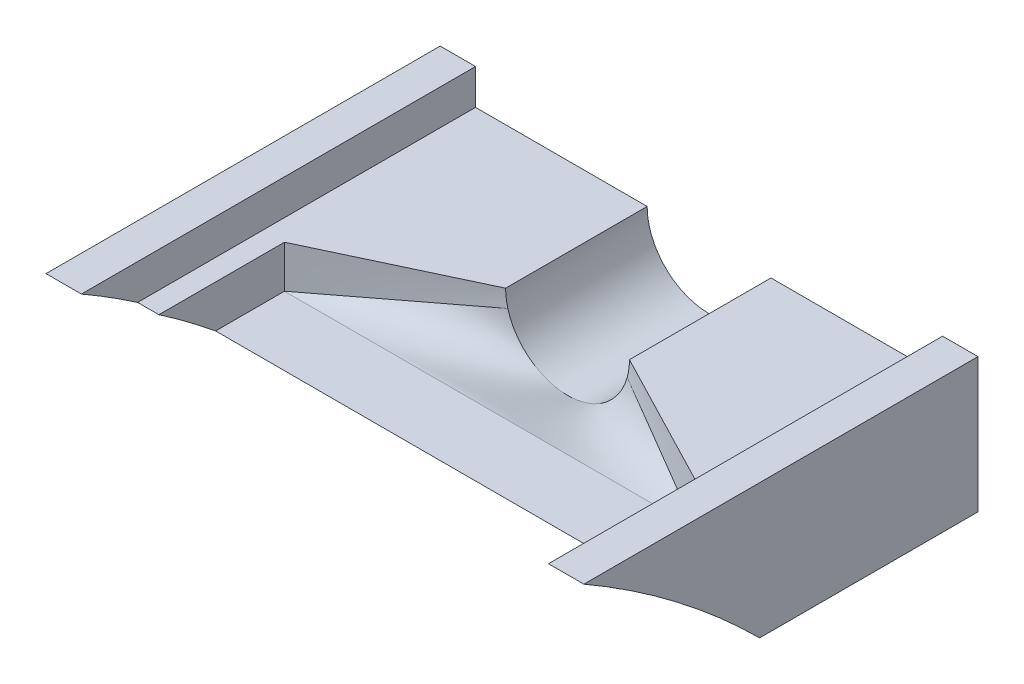
ISO-10303-21;
HEADER;
FILE_DESCRIPTION(('STEP AP214'),'2;1');
FILE_NAME('part.step','',(''),(''),'','','');
FILE_SCHEMA(('AUTOMOTIVE_DESIGN { 1 0 10303 214 1 1 1 1 }'));
ENDSEC;
DATA;
#1=APPLICATION_CONTEXT('core data for automotive mechanical design processes');
#2=APPLICATION_PROTOCOL_DEFINITION('international standard','automotive_design',2000,#1);
#3=PRODUCT_CONTEXT('',#1,'mechanical');
#4=PRODUCT('Part','Part','',(#3));
#5=PRODUCT_RELATED_PRODUCT_CATEGORY('part','',(#4));
#6=PRODUCT_DEFINITION_FORMATION('','',#4);
#7=PRODUCT_DEFINITION_CONTEXT('part definition',#1,'design');
#8=PRODUCT_DEFINITION('design','',#6,#7);
#9=PRODUCT_DEFINITION_SHAPE('','',#8);
#10=(LENGTH_UNIT() NAMED_UNIT(*) SI_UNIT(.MILLI.,.METRE.));
#11=(NAMED_UNIT(*) PLANE_ANGLE_UNIT() SI_UNIT($,.RADIAN.));
#12=(NAMED_UNIT(*) SI_UNIT($,.STERADIAN.) SOLID_ANGLE_UNIT());
#13=UNCERTAINTY_MEASURE_WITH_UNIT(LENGTH_MEASURE(1.E-05),#10,'distance_accuracy_value','');
#14=(GEOMETRIC_REPRESENTATION_CONTEXT(3) GLOBAL_UNCERTAINTY_ASSIGNED_CONTEXT((#13)) GLOBAL_UNIT_ASSIGNED_CONTEXT((#10,
#11,#12)) REPRESENTATION_CONTEXT('',''));
#15=CARTESIAN_POINT('',(0.,0.,0.));
#16=DIRECTION('',(0.,0.,1.));
#17=DIRECTION('',(1.,0.,0.));
#18=AXIS2_PLACEMENT_3D('',#15,#16,#17);
#19=CARTESIAN_POINT('',(-23.495,6.35,50.8));
#20=DIRECTION('',(0.,-1.,0.));
#21=DIRECTION('',(0.,0.,-1.));
#22=AXIS2_PLACEMENT_3D('',#19,#20,#21);
#23=PLANE('',#22);
#24=DIRECTION('',(0.,0.,-1.));
#25=VECTOR('',#24,1.);
#26=CARTESIAN_POINT('',(-20.32,6.35,50.800025));
#27=LINE('',#26,#25);
#28=CARTESIAN_POINT('',(-20.32,6.34999999999999,30.3182860225089));
#29=VERTEX_POINT('',#28);
#30=CARTESIAN_POINT('',(-20.32,6.35,0.));
#31=VERTEX_POINT('',#30);
#32=EDGE_CURVE('E371',#29,#31,#27,.T.);
#33=ORIENTED_EDGE('',*,*,#32,.F.);
#34=DIRECTION('',(1.,0.,0.));
#35=VECTOR('',#34,1.);
#36=CARTESIAN_POINT('',(-23.495,6.34999999999999,30.3182860225089));
#37=LINE('',#36,#35);
#38=CARTESIAN_POINT('',(-18.415,6.34999999999999,30.3182860225089));
#39=VERTEX_POINT('',#38);
#40=EDGE_CURVE('E560',#29,#39,#37,.T.);
#41=ORIENTED_EDGE('',*,*,#40,.T.);
#42=DIRECTION('',(0.,0.,1.));
#43=VECTOR('',#42,1.);
#44=CARTESIAN_POINT('',(-18.415,6.35,19.05));
#45=LINE('',#44,#43);
#46=CARTESIAN_POINT('',(-18.415,6.35,19.05));
#47=VERTEX_POINT('',#46);
#48=EDGE_CURVE('E271',#47,#39,#45,.T.);
#49=ORIENTED_EDGE('',*,*,#48,.F.);
#50=CARTESIAN_POINT('',(-4.92125,6.35,12.7));
#51=CARTESIAN_POINT('',(-9.41916666666667,6.35,14.8166666666667));
#52=CARTESIAN_POINT('',(-13.9170833333333,6.35,16.9333333333333));
#53=CARTESIAN_POINT('',(-18.415,6.35,19.05));
#54=B_SPLINE_CURVE_WITH_KNOTS('',3,(#50,#51,#52,#53),.UNSPECIFIED.,.F.,.F.,(4,4),(0.,1.),.UNSPECIFIED.);
#55=CARTESIAN_POINT('',(-4.92125,6.35,12.7));
#56=VERTEX_POINT('',#55);
#57=EDGE_CURVE('E495',#56,#47,#54,.T.);
#58=ORIENTED_EDGE('',*,*,#57,.F.);
#59=DIRECTION('',(0.,0.,-1.));
#60=VECTOR('',#59,1.);
#61=CARTESIAN_POINT('',(-4.92125,6.35,12.7));
#62=LINE('',#61,#60);
#63=CARTESIAN_POINT('',(-4.92125,6.35,0.));
#64=VERTEX_POINT('',#63);
#65=EDGE_CURVE('E220',#64,#56,#62,.F.);
#66=ORIENTED_EDGE('',*,*,#65,.F.);
#67=DIRECTION('',(-1.,0.,0.));
#68=VECTOR('',#67,1.);
#69=CARTESIAN_POINT('',(-23.495,6.35,0.));
#70=LINE('',#69,#68);
#71=EDGE_CURVE('E457',#64,#31,#70,.T.);
#72=ORIENTED_EDGE('',*,*,#71,.T.);
#73=EDGE_LOOP('',(#33,#41,#49,#58,#66,#72));
#74=FACE_BOUND('',#73,.T.);
#75=ADVANCED_FACE('F68',(#74),#23,.F.);
#76=DIRECTION('',(0.,0.,1.));
#77=VECTOR('',#76,1.);
#78=CARTESIAN_POINT('',(18.415,6.35,19.05));
#79=LINE('',#78,#77);
#80=CARTESIAN_POINT('',(18.415,6.35,19.05));
#81=VERTEX_POINT('',#80);
#82=CARTESIAN_POINT('',(18.415,6.35,30.3182860225089));
#83=VERTEX_POINT('',#82);
#84=EDGE_CURVE('E263',#81,#83,#79,.T.);
#85=ORIENTED_EDGE('',*,*,#84,.T.);
#86=DIRECTION('',(1.,0.,0.));
#87=VECTOR('',#86,1.);
#88=CARTESIAN_POINT('',(-23.495,6.34999999999999,30.3182860225089));
#89=LINE('',#88,#87);
#90=CARTESIAN_POINT('',(21.59,6.34999999999997,30.3182860225089));
#91=VERTEX_POINT('',#90);
#92=EDGE_CURVE('E550',#83,#91,#89,.T.);
#93=ORIENTED_EDGE('',*,*,#92,.T.);
#94=DIRECTION('',(0.,0.,-1.));
#95=VECTOR('',#94,1.);
#96=CARTESIAN_POINT('',(21.59,6.35,50.800025));
#97=LINE('',#96,#95);
#98=CARTESIAN_POINT('',(21.59,6.35,0.));
#99=VERTEX_POINT('',#98);
#100=EDGE_CURVE('E189',#91,#99,#97,.T.);
#101=ORIENTED_EDGE('',*,*,#100,.T.);
#102=CARTESIAN_POINT('',(6.19125,6.35,0.));
#103=VERTEX_POINT('',#102);
#104=EDGE_CURVE('E90',#99,#103,#70,.T.);
#105=ORIENTED_EDGE('',*,*,#104,.T.);
#106=DIRECTION('',(0.,0.,-1.));
#107=VECTOR('',#106,1.);
#108=CARTESIAN_POINT('',(6.19125,6.35,12.7));
#109=LINE('',#108,#107);
#110=CARTESIAN_POINT('',(6.19125,6.35,12.7));
#111=VERTEX_POINT('',#110);
#112=EDGE_CURVE('E534',#111,#103,#109,.T.);
#113=ORIENTED_EDGE('',*,*,#112,.F.);
#114=CARTESIAN_POINT('',(18.415,6.35,19.05));
#115=CARTESIAN_POINT('',(14.3404166666667,6.35,16.9333333333333));
#116=CARTESIAN_POINT('',(10.2658333333333,6.35,14.8166666666667));
#117=CARTESIAN_POINT('',(6.19125,6.35,12.7));
#118=B_SPLINE_CURVE_WITH_KNOTS('',3,(#114,#115,#116,#117),.UNSPECIFIED.,.F.,.F.,(4,4),(0.,1.),.UNSPECIFIED.);
#119=EDGE_CURVE('E367',#111,#81,#118,.F.);
#120=ORIENTED_EDGE('',*,*,#119,.T.);
#121=EDGE_LOOP('',(#85,#93,#101,#105,#113,#120));
#122=FACE_BOUND('',#121,.T.);
#123=ADVANCED_FACE('F240',(#122),#23,.F.);
#124=CARTESIAN_POINT('',(0.,0.,0.));
#125=DIRECTION('',(0.,0.,1.));
#126=DIRECTION('',(1.,0.,0.));
#127=AXIS2_PLACEMENT_3D('',#124,#125,#126);
#128=PLANE('',#127);
#129=CARTESIAN_POINT('',(0.635,6.34999999999999,0.));
#130=DIRECTION('',(0.,0.,1.));
#131=DIRECTION('',(1.,0.,0.));
#132=AXIS2_PLACEMENT_3D('',#129,#130,#131);
#133=CIRCLE('',#132,5.55625);
#134=EDGE_CURVE('E76',#103,#64,#133,.F.);
#135=ORIENTED_EDGE('',*,*,#134,.F.);
#136=ORIENTED_EDGE('',*,*,#104,.F.);
#137=DIRECTION('',(0.,1.,0.));
#138=VECTOR('',#137,1.);
#139=CARTESIAN_POINT('',(21.59,6.35,0.));
#140=LINE('',#139,#138);
#141=CARTESIAN_POINT('',(21.59,9.525,0.));
#142=VERTEX_POINT('',#141);
#143=EDGE_CURVE('E470',#99,#142,#140,.T.);
#144=ORIENTED_EDGE('',*,*,#143,.T.);
#145=DIRECTION('',(1.,0.,0.));
#146=VECTOR('',#145,1.);
#147=CARTESIAN_POINT('',(21.59,9.525,0.));
#148=LINE('',#147,#146);
#149=CARTESIAN_POINT('',(24.765,9.525,0.));
#150=VERTEX_POINT('',#149);
#151=EDGE_CURVE('E468',#142,#150,#148,.T.);
#152=ORIENTED_EDGE('',*,*,#151,.T.);
#153=DIRECTION('',(0.,1.,0.));
#154=VECTOR('',#153,1.);
#155=CARTESIAN_POINT('',(24.765,6.35,0.));
#156=LINE('',#155,#154);
#157=CARTESIAN_POINT('',(24.765,-2.54,0.));
#158=VERTEX_POINT('',#157);
#159=EDGE_CURVE('E455',#158,#150,#156,.T.);
#160=ORIENTED_EDGE('',*,*,#159,.F.);
#161=DIRECTION('',(1.,0.,0.));
#162=VECTOR('',#161,1.);
#163=CARTESIAN_POINT('',(-23.495,-2.54,0.));
#164=LINE('',#163,#162);
#165=CARTESIAN_POINT('',(-23.495,-2.54,0.));
#166=VERTEX_POINT('',#165);
#167=EDGE_CURVE('E201',#166,#158,#164,.T.);
#168=ORIENTED_EDGE('',*,*,#167,.F.);
#169=DIRECTION('',(0.,-1.,0.));
#170=VECTOR('',#169,1.);
#171=CARTESIAN_POINT('',(-23.495,6.35,0.));
#172=LINE('',#171,#170);
#173=CARTESIAN_POINT('',(-23.495,9.525,0.));
#174=VERTEX_POINT('',#173);
#175=EDGE_CURVE('E206',#174,#166,#172,.T.);
#176=ORIENTED_EDGE('',*,*,#175,.F.);
#177=DIRECTION('',(-1.,0.,0.));
#178=VECTOR('',#177,1.);
#179=CARTESIAN_POINT('',(0.,9.525,0.));
#180=LINE('',#179,#178);
#181=CARTESIAN_POINT('',(-20.32,9.525,0.));
#182=VERTEX_POINT('',#181);
#183=EDGE_CURVE('E483',#182,#174,#180,.T.);
#184=ORIENTED_EDGE('',*,*,#183,.F.);
#185=DIRECTION('',(0.,1.,0.));
#186=VECTOR('',#185,1.);
#187=CARTESIAN_POINT('',(-20.32,0.,0.));
#188=LINE('',#187,#186);
#189=EDGE_CURVE('E475',#31,#182,#188,.T.);
#190=ORIENTED_EDGE('',*,*,#189,.F.);
#191=ORIENTED_EDGE('',*,*,#71,.F.);
#192=EDGE_LOOP('',(#135,#136,#144,#152,#160,#168,#176,#184,#190,#191));
#193=FACE_BOUND('',#192,.T.);
#194=ADVANCED_FACE('F237',(#193),#128,.F.);
#195=CARTESIAN_POINT('',(24.765,6.35,50.8));
#196=DIRECTION('',(-1.,0.,0.));
#197=DIRECTION('',(0.,0.,1.));
#198=AXIS2_PLACEMENT_3D('',#195,#196,#197);
#199=PLANE('',#198);
#200=DIRECTION('',(0.,0.,-1.));
#201=VECTOR('',#200,1.);
#202=CARTESIAN_POINT('',(24.765,9.525,50.800025));
#203=LINE('',#202,#201);
#204=CARTESIAN_POINT('',(24.765,9.525,35.3661608291781));
#205=VERTEX_POINT('',#204);
#206=EDGE_CURVE('E197',#205,#150,#203,.T.);
#207=ORIENTED_EDGE('',*,*,#206,.F.);
#208=CARTESIAN_POINT('',(24.765,-56.5150000000001,73.3813998788012));
#209=DIRECTION('',(1.,0.,0.));
#210=DIRECTION('',(0.,0.,-1.));
#211=AXIS2_PLACEMENT_3D('',#208,#209,#210);
#212=CIRCLE('',#211,76.2);
#213=CARTESIAN_POINT('',(24.765,-2.54,19.593488829942));
#214=VERTEX_POINT('',#213);
#215=EDGE_CURVE('E82',#214,#205,#212,.T.);
#216=ORIENTED_EDGE('',*,*,#215,.F.);
#217=DIRECTION('',(0.,0.,-1.));
#218=VECTOR('',#217,1.);
#219=CARTESIAN_POINT('',(24.765,-2.54,50.8));
#220=LINE('',#219,#218);
#221=EDGE_CURVE('E195',#214,#158,#220,.T.);
#222=ORIENTED_EDGE('',*,*,#221,.T.);
#223=ORIENTED_EDGE('',*,*,#159,.T.);
#224=EDGE_LOOP('',(#207,#216,#222,#223));
#225=FACE_BOUND('',#224,.T.);
#226=ADVANCED_FACE('F70',(#225),#199,.F.);
#227=CARTESIAN_POINT('',(-23.495,6.35,50.8));
#228=DIRECTION('',(1.,0.,0.));
#229=DIRECTION('',(0.,0.,-1.));
#230=AXIS2_PLACEMENT_3D('',#227,#228,#229);
#231=PLANE('',#230);
#232=DIRECTION('',(0.,0.,-1.));
#233=VECTOR('',#232,1.);
#234=CARTESIAN_POINT('',(-23.495,-2.54,50.8));
#235=LINE('',#234,#233);
#236=CARTESIAN_POINT('',(-23.495,-2.54,19.593488829942));
#237=VERTEX_POINT('',#236);
#238=EDGE_CURVE('E203',#237,#166,#235,.T.);
#239=ORIENTED_EDGE('',*,*,#238,.F.);
#240=CARTESIAN_POINT('',(-23.495,-56.5150000000001,73.3813998788012));
#241=DIRECTION('',(1.,0.,0.));
#242=DIRECTION('',(0.,0.,-1.));
#243=AXIS2_PLACEMENT_3D('',#240,#241,#242);
#244=CIRCLE('',#243,76.2);
#245=CARTESIAN_POINT('',(-23.495,9.52499999999999,35.3661608291781));
#246=VERTEX_POINT('',#245);
#247=EDGE_CURVE('E185',#237,#246,#244,.T.);
#248=ORIENTED_EDGE('',*,*,#247,.T.);
#249=DIRECTION('',(0.,0.,-1.));
#250=VECTOR('',#249,1.);
#251=CARTESIAN_POINT('',(-23.495,9.525,50.800025));
#252=LINE('',#251,#250);
#253=EDGE_CURVE('E461',#246,#174,#252,.T.);
#254=ORIENTED_EDGE('',*,*,#253,.T.);
#255=ORIENTED_EDGE('',*,*,#175,.T.);
#256=EDGE_LOOP('',(#239,#248,#254,#255));
#257=FACE_BOUND('',#256,.T.);
#258=ADVANCED_FACE('F244',(#257),#231,.F.);
#259=CARTESIAN_POINT('',(-23.495,-2.54,50.8));
#260=DIRECTION('',(0.,1.,0.));
#261=DIRECTION('',(0.,0.,1.));
#262=AXIS2_PLACEMENT_3D('',#259,#260,#261);
#263=PLANE('',#262);
#264=ORIENTED_EDGE('',*,*,#221,.F.);
#265=DIRECTION('',(1.,0.,0.));
#266=VECTOR('',#265,1.);
#267=CARTESIAN_POINT('',(-23.495,-2.54,19.593488829942));
#268=LINE('',#267,#266);
#269=EDGE_CURVE('E182',#214,#237,#268,.F.);
#270=ORIENTED_EDGE('',*,*,#269,.T.);
#271=ORIENTED_EDGE('',*,*,#238,.T.);
#272=ORIENTED_EDGE('',*,*,#167,.T.);
#273=EDGE_LOOP('',(#264,#270,#271,#272));
#274=FACE_BOUND('',#273,.T.);
#275=ADVANCED_FACE('F199',(#274),#263,.F.);
#276=CARTESIAN_POINT('',(0.635,6.34999999999999,12.7));
#277=DIRECTION('',(0.,0.,-1.));
#278=DIRECTION('',(-1.,0.,0.));
#279=AXIS2_PLACEMENT_3D('',#276,#277,#278);
#280=CYLINDRICAL_SURFACE('',#279,5.55625);
#281=ORIENTED_EDGE('',*,*,#65,.T.);
#282=CARTESIAN_POINT('',(-4.72101864474134,4.87183277682016,12.7));
#283=CARTESIAN_POINT('',(-4.75418863957491,4.9920215538331,12.7));
#284=CARTESIAN_POINT('',(-4.81243507946018,5.23463461798272,12.7));
#285=CARTESIAN_POINT('',(-4.87512462747497,5.60360035578366,12.7));
#286=CARTESIAN_POINT('',(-4.91285362028412,5.97595354903661,12.7));
#287=CARTESIAN_POINT('',(-4.92125,6.22531804189409,12.7));
#288=CARTESIAN_POINT('',(-4.92125,6.35,12.7));
#289=B_SPLINE_CURVE_WITH_KNOTS('',3,(#282,#283,#284,#285,#286,#287,#288),.UNSPECIFIED.,.F.,.F.,
(4,1,1,1,4),(0.,0.0214285714285714,0.0428571428571429,0.0642857142857143,0.0857142857142857),.UNSPECIFIED.);
#290=CARTESIAN_POINT('',(-4.72139345933775,4.87172840631148,12.7));
#291=VERTEX_POINT('',#290);
#292=EDGE_CURVE('E215',#56,#291,#289,.F.);
#293=ORIENTED_EDGE('',*,*,#292,.T.);
#294=CARTESIAN_POINT('',(0.635,6.34999999999999,12.7));
#295=DIRECTION('',(0.,0.,1.));
#296=DIRECTION('',(1.,0.,0.));
#297=AXIS2_PLACEMENT_3D('',#294,#295,#296);
#298=CIRCLE('',#297,5.55625);
#299=CARTESIAN_POINT('',(5.99135033199777,4.87174042441235,12.7));
#300=VERTEX_POINT('',#299);
#301=EDGE_CURVE('E366',#291,#300,#298,.T.);
#302=ORIENTED_EDGE('',*,*,#301,.T.);
#303=EDGE_CURVE('E358',#300,#111,#298,.T.);
#304=ORIENTED_EDGE('',*,*,#303,.T.);
#305=ORIENTED_EDGE('',*,*,#112,.T.);
#306=ORIENTED_EDGE('',*,*,#134,.T.);
#307=EDGE_LOOP('',(#281,#293,#302,#304,#305,#306));
#308=FACE_BOUND('',#307,.T.);
#309=ADVANCED_FACE('F224',(#308),#280,.F.);
#310=CARTESIAN_POINT('',(-18.415,6.35,19.05));
#311=DIRECTION('',(-1.,0.,0.));
#312=DIRECTION('',(0.,-1.,0.));
#313=AXIS2_PLACEMENT_3D('',#310,#311,#312);
#314=PLANE('',#313);
#315=ORIENTED_EDGE('',*,*,#48,.T.);
#316=CARTESIAN_POINT('',(-18.4149999999999,-56.5150000000001,73.3813998788012));
#317=DIRECTION('',(-1.,0.,0.));
#318=DIRECTION('',(0.,-1.,0.));
#319=AXIS2_PLACEMENT_3D('',#316,#317,#318);
#320=CIRCLE('',#319,76.2);
#321=CARTESIAN_POINT('',(-18.415,2.54,25.2259539250984));
#322=VERTEX_POINT('',#321);
#323=EDGE_CURVE('E552',#39,#322,#320,.T.);
#324=ORIENTED_EDGE('',*,*,#323,.T.);
#325=DIRECTION('',(0.,0.,1.));
#326=VECTOR('',#325,1.);
#327=CARTESIAN_POINT('',(-18.415,2.54,19.05));
#328=LINE('',#327,#326);
#329=CARTESIAN_POINT('',(-18.415,2.54,19.05));
#330=VERTEX_POINT('',#329);
#331=EDGE_CURVE('E286',#330,#322,#328,.T.);
#332=ORIENTED_EDGE('',*,*,#331,.F.);
#333=CARTESIAN_POINT('',(-18.415,6.35,19.05));
#334=CARTESIAN_POINT('',(-18.415,6.0325,19.05));
#335=CARTESIAN_POINT('',(-18.415,5.3975,19.05));
#336=CARTESIAN_POINT('',(-18.415,4.445,19.05));
#337=CARTESIAN_POINT('',(-18.415,3.4925,19.05));
#338=CARTESIAN_POINT('',(-18.415,2.8575,19.05));
#339=CARTESIAN_POINT('',(-18.415,2.54,19.05));
#340=B_SPLINE_CURVE_WITH_KNOTS('',3,(#333,#334,#335,#336,#337,#338,#339),.UNSPECIFIED.,.F.,.F.,
(4,1,1,1,4),(0.,0.0214285714285714,0.0428571428571429,0.0642857142857143,0.0857142857142857),.UNSPECIFIED.);
#341=EDGE_CURVE('E281',#47,#330,#340,.T.);
#342=ORIENTED_EDGE('',*,*,#341,.F.);
#343=EDGE_LOOP('',(#315,#324,#332,#342));
#344=FACE_BOUND('',#343,.T.);
#345=ADVANCED_FACE('F234',(#344),#314,.F.);
#346=CARTESIAN_POINT('',(18.415,2.54,19.05));
#347=DIRECTION('',(1.,0.,0.));
#348=DIRECTION('',(0.,1.,0.));
#349=AXIS2_PLACEMENT_3D('',#346,#347,#348);
#350=PLANE('',#349);
#351=DIRECTION('',(0.,0.,1.));
#352=VECTOR('',#351,1.);
#353=CARTESIAN_POINT('',(18.415,2.54,19.05));
#354=LINE('',#353,#352);
#355=CARTESIAN_POINT('',(18.415,2.54,19.05));
#356=VERTEX_POINT('',#355);
#357=CARTESIAN_POINT('',(18.415,2.54,25.2259539250984));
#358=VERTEX_POINT('',#357);
#359=EDGE_CURVE('E272',#356,#358,#354,.T.);
#360=ORIENTED_EDGE('',*,*,#359,.T.);
#361=CARTESIAN_POINT('',(18.4149999999999,-56.5150000000001,73.3813998788012));
#362=DIRECTION('',(1.,0.,0.));
#363=DIRECTION('',(0.,1.,0.));
#364=AXIS2_PLACEMENT_3D('',#361,#362,#363);
#365=CIRCLE('',#364,76.2);
#366=EDGE_CURVE('E547',#358,#83,#365,.T.);
#367=ORIENTED_EDGE('',*,*,#366,.T.);
#368=ORIENTED_EDGE('',*,*,#84,.F.);
#369=CARTESIAN_POINT('',(18.415,2.54,19.05));
#370=CARTESIAN_POINT('',(18.415,2.8575,19.05));
#371=CARTESIAN_POINT('',(18.415,3.49249999999999,19.05));
#372=CARTESIAN_POINT('',(18.415,4.44500000000001,19.05));
#373=CARTESIAN_POINT('',(18.415,5.39749999999999,19.05));
#374=CARTESIAN_POINT('',(18.415,6.0325,19.05));
#375=CARTESIAN_POINT('',(18.415,6.35,19.05));
#376=B_SPLINE_CURVE_WITH_KNOTS('',3,(#369,#370,#371,#372,#373,#374,#375),.UNSPECIFIED.,.F.,.F.,
(4,1,1,1,4),(0.914285714285714,0.935714285714286,0.957142857142857,0.978571428571429,1.),.UNSPECIFIED.);
#377=EDGE_CURVE('E294',#356,#81,#376,.T.);
#378=ORIENTED_EDGE('',*,*,#377,.F.);
#379=EDGE_LOOP('',(#360,#367,#368,#378));
#380=FACE_BOUND('',#379,.T.);
#381=ADVANCED_FACE('F316',(#380),#350,.F.);
#382=CARTESIAN_POINT('',(-18.415,2.54,19.05));
#383=DIRECTION('',(0.,-1.,0.));
#384=DIRECTION('',(0.,0.,-1.));
#385=AXIS2_PLACEMENT_3D('',#382,#383,#384);
#386=PLANE('',#385);
#387=ORIENTED_EDGE('',*,*,#331,.T.);
#388=DIRECTION('',(1.,0.,0.));
#389=VECTOR('',#388,1.);
#390=CARTESIAN_POINT('',(-23.495,2.54,25.2259539250984));
#391=LINE('',#390,#389);
#392=EDGE_CURVE('E549',#322,#358,#391,.T.);
#393=ORIENTED_EDGE('',*,*,#392,.T.);
#394=ORIENTED_EDGE('',*,*,#359,.F.);
#395=CARTESIAN_POINT('',(-18.415,2.54,19.05));
#396=CARTESIAN_POINT('',(-16.8804166666667,2.54,19.05));
#397=CARTESIAN_POINT('',(-13.81125,2.54,19.05));
#398=CARTESIAN_POINT('',(-9.2075,2.54,19.05));
#399=CARTESIAN_POINT('',(-4.60375,2.54,19.05));
#400=CARTESIAN_POINT('',(0.,2.54,19.05));
#401=CARTESIAN_POINT('',(4.60375,2.54,19.05));
#402=CARTESIAN_POINT('',(9.2075,2.54,19.05));
#403=CARTESIAN_POINT('',(13.81125,2.54,19.05));
#404=CARTESIAN_POINT('',(16.8804166666667,2.54,19.05));
#405=CARTESIAN_POINT('',(18.415,2.54,19.05));
#406=B_SPLINE_CURVE_WITH_KNOTS('',3,(#395,#396,#397,#398,#399,#400,#401,#402,#403,#404,#405),
.UNSPECIFIED.,.F.,.F.,(4,1,1,1,1,1,1,1,4),(0.0857142857142857,0.189285714285714,
0.292857142857143,0.396428571428571,0.5,0.603571428571429,0.707142857142857,0.810714285714286,
0.914285714285714),.UNSPECIFIED.);
#407=CARTESIAN_POINT('',(11.5341450872156,2.54,19.05));
#408=VERTEX_POINT('',#407);
#409=EDGE_CURVE('E338',#408,#356,#406,.T.);
#410=ORIENTED_EDGE('',*,*,#409,.F.);
#411=CARTESIAN_POINT('',(-18.415,2.54,19.05));
#412=CARTESIAN_POINT('',(-16.8804166666667,2.54,19.05));
#413=CARTESIAN_POINT('',(-13.81125,2.54,19.05));
#414=CARTESIAN_POINT('',(-9.2075,2.54,19.05));
#415=CARTESIAN_POINT('',(-4.60375,2.54,19.05));
#416=CARTESIAN_POINT('',(0.,2.54,19.05));
#417=CARTESIAN_POINT('',(4.60375,2.54,19.05));
#418=CARTESIAN_POINT('',(9.2075,2.54,19.05));
#419=CARTESIAN_POINT('',(13.81125,2.54,19.05));
#420=CARTESIAN_POINT('',(16.8804166666667,2.54,19.05));
#421=CARTESIAN_POINT('',(18.415,2.54,19.05));
#422=B_SPLINE_CURVE_WITH_KNOTS('',3,(#411,#412,#413,#414,#415,#416,#417,#418,#419,#420,#421),
.UNSPECIFIED.,.F.,.F.,(4,1,1,1,1,1,1,1,4),(0.0857142857142857,0.189285714285714,
0.292857142857143,0.396428571428571,0.5,0.603571428571429,0.707142857142857,0.810714285714286,
0.914285714285714),.UNSPECIFIED.);
#423=CARTESIAN_POINT('',(4.67923219690711,2.54,19.05));
#424=VERTEX_POINT('',#423);
#425=EDGE_CURVE('E705',#424,#408,#422,.T.);
#426=ORIENTED_EDGE('',*,*,#425,.F.);
#427=CARTESIAN_POINT('',(-18.415,2.54,19.05));
#428=CARTESIAN_POINT('',(-16.8804166666667,2.54,19.05));
#429=CARTESIAN_POINT('',(-13.81125,2.54,19.05));
#430=CARTESIAN_POINT('',(-9.2075,2.54,19.05));
#431=CARTESIAN_POINT('',(-4.60375,2.54,19.05));
#432=CARTESIAN_POINT('',(0.,2.54,19.05));
#433=CARTESIAN_POINT('',(4.60375,2.54,19.05));
#434=CARTESIAN_POINT('',(9.2075,2.54,19.05));
#435=CARTESIAN_POINT('',(13.81125,2.54,19.05));
#436=CARTESIAN_POINT('',(16.8804166666667,2.54,19.05));
#437=CARTESIAN_POINT('',(18.415,2.54,19.05));
#438=B_SPLINE_CURVE_WITH_KNOTS('',3,(#427,#428,#429,#430,#431,#432,#433,#434,#435,#436,#437),
.UNSPECIFIED.,.F.,.F.,(4,1,1,1,1,1,1,1,4),(0.0857142857142857,0.189285714285714,
0.292857142857143,0.396428571428571,0.5,0.603571428571429,0.707142857142857,0.810714285714286,
0.914285714285714),.UNSPECIFIED.);
#439=CARTESIAN_POINT('',(-11.5341450872156,2.54,19.05));
#440=VERTEX_POINT('',#439);
#441=EDGE_CURVE('E438',#440,#424,#438,.T.);
#442=ORIENTED_EDGE('',*,*,#441,.F.);
#443=CARTESIAN_POINT('',(-18.415,2.54,19.05));
#444=CARTESIAN_POINT('',(-16.8804166666667,2.54,19.05));
#445=CARTESIAN_POINT('',(-13.81125,2.54,19.05));
#446=CARTESIAN_POINT('',(-9.2075,2.54,19.05));
#447=CARTESIAN_POINT('',(-4.60375,2.54,19.05));
#448=CARTESIAN_POINT('',(0.,2.54,19.05));
#449=CARTESIAN_POINT('',(4.60375,2.54,19.05));
#450=CARTESIAN_POINT('',(9.2075,2.54,19.05));
#451=CARTESIAN_POINT('',(13.81125,2.54,19.05));
#452=CARTESIAN_POINT('',(16.8804166666667,2.54,19.05));
#453=CARTESIAN_POINT('',(18.415,2.54,19.05));
#454=B_SPLINE_CURVE_WITH_KNOTS('',3,(#443,#444,#445,#446,#447,#448,#449,#450,#451,#452,#453),
.UNSPECIFIED.,.F.,.F.,(4,1,1,1,1,1,1,1,4),(0.0857142857142857,0.189285714285714,
0.292857142857143,0.396428571428571,0.5,0.603571428571429,0.707142857142857,0.810714285714286,
0.914285714285714),.UNSPECIFIED.);
#455=EDGE_CURVE('E301',#330,#440,#454,.T.);
#456=ORIENTED_EDGE('',*,*,#455,.F.);
#457=EDGE_LOOP('',(#387,#393,#394,#410,#426,#442,#456));
#458=FACE_BOUND('',#457,.T.);
#459=ADVANCED_FACE('F306',(#458),#386,.F.);
#460=CARTESIAN_POINT('',(5.99101864474134,4.87183277682016,12.7));
#461=CARTESIAN_POINT('',(10.1323457631609,4.09455518454677,14.8166666666667));
#462=CARTESIAN_POINT('',(14.2736728815804,3.31727759227339,16.9333333333333));
#463=CARTESIAN_POINT('',(18.415,2.54,19.05));
#464=CARTESIAN_POINT('',(6.02418863957491,4.9920215538331,12.7));
#465=CARTESIAN_POINT('',(10.1544590930499,4.28051436922206,14.8166666666667));
#466=CARTESIAN_POINT('',(14.284729546525,3.56900718461103,16.9333333333333));
#467=CARTESIAN_POINT('',(18.415,2.8575,19.05));
#468=CARTESIAN_POINT('',(6.08243498444065,5.23463341009776,12.7));
#469=CARTESIAN_POINT('',(10.1932899896271,4.6539222733985,14.8166666666667));
#470=CARTESIAN_POINT('',(14.3041449948135,4.07321113669925,16.9333333333333));
#471=CARTESIAN_POINT('',(18.415,3.49249999999999,19.05));
#472=CARTESIAN_POINT('',(6.14512530557085,5.60360536168845,12.7));
#473=CARTESIAN_POINT('',(10.2350835370472,5.21740357445897,14.8166666666667));
#474=CARTESIAN_POINT('',(14.3250417685236,4.83120178722949,16.9333333333333));
#475=CARTESIAN_POINT('',(18.415,4.44500000000001,19.05));
#476=CARTESIAN_POINT('',(6.18285339053752,5.97595235940166,12.7));
#477=CARTESIAN_POINT('',(10.2602355936917,5.78313490626777,14.8166666666667));
#478=CARTESIAN_POINT('',(14.3376177968458,5.59031745313388,16.9333333333333));
#479=CARTESIAN_POINT('',(18.415,5.39749999999999,19.05));
#480=CARTESIAN_POINT('',(6.19125,6.22531804189409,12.7));
#481=CARTESIAN_POINT('',(10.2658333333333,6.16104536126272,14.8166666666667));
#482=CARTESIAN_POINT('',(14.3404166666667,6.09677268063136,16.9333333333333));
#483=CARTESIAN_POINT('',(18.415,6.0325,19.05));
#484=CARTESIAN_POINT('',(6.19125,6.35,12.7));
#485=CARTESIAN_POINT('',(10.2658333333333,6.35,14.8166666666667));
#486=CARTESIAN_POINT('',(14.3404166666667,6.35,16.9333333333333));
#487=CARTESIAN_POINT('',(18.415,6.35,19.05));
#488=B_SPLINE_SURFACE_WITH_KNOTS('',3,3,((#460,#461,#462,#463),(#464,#465,#466,#467),(#468,#469,
#470,#471),(#472,#473,#474,#475),(#476,#477,#478,#479),(#480,#481,#482,#483),(#484,#485,#486,
#487)),.UNSPECIFIED.,.F.,.F.,.F.,(4,1,1,1,4),(4,4),(0.914285714285714,0.935714285714286,
0.957142857142857,0.978571428571429,1.),(0.,1.),.UNSPECIFIED.);
#489=DIRECTION('',(0.878255120792634,-0.164837986995818,0.448883482481459));
#490=VECTOR('',#489,1.);
#491=CARTESIAN_POINT('',(12.2030093223707,3.70591638841008,15.875));
#492=LINE('',#491,#490);
#493=EDGE_CURVE('E445',#300,#356,#492,.T.);
#494=ORIENTED_EDGE('',*,*,#303,.F.);
#495=ORIENTED_EDGE('',*,*,#493,.T.);
#496=ORIENTED_EDGE('',*,*,#377,.T.);
#497=ORIENTED_EDGE('',*,*,#119,.F.);
#498=EDGE_LOOP('',(#494,#495,#496,#497));
#499=FACE_BOUND('',#498,.T.);
#500=ADVANCED_FACE('F315',(#499),#488,.F.);
#501=CARTESIAN_POINT('',(-4.72101864474134,4.87183277682016,12.7));
#502=CARTESIAN_POINT('',(-9.28567909649422,4.09455518454677,14.8166666666667));
#503=CARTESIAN_POINT('',(-13.8503395482471,3.31727759227339,16.9333333333333));
#504=CARTESIAN_POINT('',(-18.415,2.54,19.05));
#505=CARTESIAN_POINT('',(-4.56069700382723,4.29092035742267,12.7));
#506=CARTESIAN_POINT('',(-8.66727022477371,3.70728023828178,14.8166666666667));
#507=CARTESIAN_POINT('',(-12.7738434457202,3.12364011914089,16.9333333333333));
#508=CARTESIAN_POINT('',(-16.8804166666667,2.54,19.05));
#509=CARTESIAN_POINT('',(-4.04953305083371,3.18177336599491,12.7));
#510=CARTESIAN_POINT('',(-7.30343870055581,2.96784891066327,14.8166666666667));
#511=CARTESIAN_POINT('',(-10.5573443502779,2.75392445533164,16.9333333333333));
#512=CARTESIAN_POINT('',(-13.81125,2.54,19.05));
#513=CARTESIAN_POINT('',(-2.79086460882338,1.85055059350643,12.7));
#514=CARTESIAN_POINT('',(-4.92974307254892,2.08036706233762,14.8166666666667));
#515=CARTESIAN_POINT('',(-7.06862153627446,2.31018353116881,16.9333333333333));
#516=CARTESIAN_POINT('',(-9.2075,2.54,19.05));
#517=CARTESIAN_POINT('',(-1.17282135590894,0.991482698464811,12.7));
#518=CARTESIAN_POINT('',(-2.31646423727263,1.50765513230987,14.8166666666667));
#519=CARTESIAN_POINT('',(-3.46010711863631,2.02382756615494,16.9333333333333));
#520=CARTESIAN_POINT('',(-4.60375,2.54,19.05));
#521=CARTESIAN_POINT('',(0.634999999999996,0.694751254482738,12.7));
#522=CARTESIAN_POINT('',(0.42333333333333,1.30983416965516,14.8166666666667));
#523=CARTESIAN_POINT('',(0.211666666666664,1.92491708482758,16.9333333333333));
#524=CARTESIAN_POINT('',(0.,2.54,19.05));
#525=CARTESIAN_POINT('',(2.44282135590896,0.99148269846481,12.7));
#526=CARTESIAN_POINT('',(3.1631309039393,1.50765513230987,14.8166666666666));
#527=CARTESIAN_POINT('',(3.88344045196965,2.02382756615494,16.9333333333333));
#528=CARTESIAN_POINT('',(4.60375,2.54,19.05));
#529=CARTESIAN_POINT('',(4.06086460882337,1.85055059350643,12.7000000000001));
#530=CARTESIAN_POINT('',(5.77640973921558,2.08036706233762,14.8166666666667));
#531=CARTESIAN_POINT('',(7.49195486960779,2.31018353116881,16.9333333333334));
#532=CARTESIAN_POINT('',(9.2075,2.54,19.05));
#533=CARTESIAN_POINT('',(5.31953305083373,3.18177336599491,12.7));
#534=CARTESIAN_POINT('',(8.15010536722248,2.96784891066327,14.8166666666666));
#535=CARTESIAN_POINT('',(10.9806776836112,2.75392445533164,16.9333333333333));
#536=CARTESIAN_POINT('',(13.81125,2.54,19.05));
#537=CARTESIAN_POINT('',(5.83069700382723,4.29092035742267,12.7));
#538=CARTESIAN_POINT('',(9.51393689144038,3.70728023828178,14.8166666666667));
#539=CARTESIAN_POINT('',(13.1971767790535,3.12364011914089,16.9333333333333));
#540=CARTESIAN_POINT('',(16.8804166666667,2.54,19.05));
#541=CARTESIAN_POINT('',(5.99101864474134,4.87183277682016,12.7));
#542=CARTESIAN_POINT('',(10.1323457631609,4.09455518454677,14.8166666666667));
#543=CARTESIAN_POINT('',(14.2736728815804,3.31727759227339,16.9333333333333));
#544=CARTESIAN_POINT('',(18.415,2.54,19.05));
#545=B_SPLINE_SURFACE_WITH_KNOTS('',3,3,((#501,#502,#503,#504),(#505,#506,#507,#508),(#509,#510,
#511,#512),(#513,#514,#515,#516),(#517,#518,#519,#520),(#521,#522,#523,#524),(#525,#526,#527,
#528),(#529,#530,#531,#532),(#533,#534,#535,#536),(#537,#538,#539,#540),(#541,#542,#543,#544)),
.UNSPECIFIED.,.F.,.F.,.F.,(4,1,1,1,1,1,1,1,4),(4,4),(0.0857142857142857,0.189285714285714,
0.292857142857143,0.396428571428571,0.5,0.603571428571429,0.707142857142857,0.810714285714286,
0.914285714285714),(0.,1.),.UNSPECIFIED.);
#546=DIRECTION('',(-0.89657424691038,-0.152670079034074,0.415748080867266));
#547=VECTOR('',#546,1.);
#548=CARTESIAN_POINT('',(-11.5680093223707,3.70591638841008,15.875));
#549=LINE('',#548,#547);
#550=EDGE_CURVE('E489',#291,#330,#549,.T.);
#551=ORIENTED_EDGE('',*,*,#425,.T.);
#552=ORIENTED_EDGE('',*,*,#409,.T.);
#553=ORIENTED_EDGE('',*,*,#493,.F.);
#554=ORIENTED_EDGE('',*,*,#301,.F.);
#555=ORIENTED_EDGE('',*,*,#550,.T.);
#556=ORIENTED_EDGE('',*,*,#455,.T.);
#557=ORIENTED_EDGE('',*,*,#441,.T.);
#558=EDGE_LOOP('',(#551,#552,#553,#554,#555,#556,#557));
#559=FACE_BOUND('',#558,.T.);
#560=ADVANCED_FACE('F391',(#559),#545,.F.);
#561=CARTESIAN_POINT('',(-4.92125,6.35,12.7));
#562=CARTESIAN_POINT('',(-9.41916666666667,6.35,14.8166666666667));
#563=CARTESIAN_POINT('',(-13.9170833333333,6.35,16.9333333333333));
#564=CARTESIAN_POINT('',(-18.415,6.35,19.05));
#565=CARTESIAN_POINT('',(-4.92125,6.22531804189409,12.7));
#566=CARTESIAN_POINT('',(-9.41916666666667,6.16104536126272,14.8166666666667));
#567=CARTESIAN_POINT('',(-13.9170833333333,6.09677268063136,16.9333333333333));
#568=CARTESIAN_POINT('',(-18.415,6.0325,19.05));
#569=CARTESIAN_POINT('',(-4.91285362028412,5.97595354903661,12.7));
#570=CARTESIAN_POINT('',(-9.41356908018942,5.78313569935774,14.8166666666667));
#571=CARTESIAN_POINT('',(-13.9142845400947,5.59031784967887,16.9333333333333));
#572=CARTESIAN_POINT('',(-18.415,5.3975,19.05));
#573=CARTESIAN_POINT('',(-4.87512462747497,5.60360035578366,12.7));
#574=CARTESIAN_POINT('',(-9.38841641831664,5.21740023718911,14.8166666666667));
#575=CARTESIAN_POINT('',(-13.9017082091583,4.83120011859455,16.9333333333333));
#576=CARTESIAN_POINT('',(-18.415,4.445,19.05));
#577=CARTESIAN_POINT('',(-4.81243507946018,5.23463461798272,12.7));
#578=CARTESIAN_POINT('',(-9.34662338630679,4.65392307865515,14.8166666666667));
#579=CARTESIAN_POINT('',(-13.8808116931534,4.07321153932757,16.9333333333333));
#580=CARTESIAN_POINT('',(-18.415,3.4925,19.05));
#581=CARTESIAN_POINT('',(-4.75418863957491,4.9920215538331,12.7));
#582=CARTESIAN_POINT('',(-9.30779242638327,4.28051436922206,14.8166666666667));
#583=CARTESIAN_POINT('',(-13.8613962131916,3.56900718461103,16.9333333333333));
#584=CARTESIAN_POINT('',(-18.415,2.8575,19.05));
#585=CARTESIAN_POINT('',(-4.72101864474134,4.87183277682016,12.7));
#586=CARTESIAN_POINT('',(-9.28567909649422,4.09455518454677,14.8166666666667));
#587=CARTESIAN_POINT('',(-13.8503395482471,3.31727759227339,16.9333333333333));
#588=CARTESIAN_POINT('',(-18.415,2.54,19.05));
#589=B_SPLINE_SURFACE_WITH_KNOTS('',3,3,((#561,#562,#563,#564),(#565,#566,#567,#568),(#569,#570,
#571,#572),(#573,#574,#575,#576),(#577,#578,#579,#580),(#581,#582,#583,#584),(#585,#586,#587,
#588)),.UNSPECIFIED.,.F.,.F.,.F.,(4,1,1,1,4),(4,4),(0.,0.0214285714285714,0.0428571428571429,
0.0642857142857143,0.0857142857142857),(0.,1.),.UNSPECIFIED.);
#590=ORIENTED_EDGE('',*,*,#292,.F.);
#591=ORIENTED_EDGE('',*,*,#57,.T.);
#592=ORIENTED_EDGE('',*,*,#341,.T.);
#593=ORIENTED_EDGE('',*,*,#550,.F.);
#594=EDGE_LOOP('',(#590,#591,#592,#593));
#595=FACE_BOUND('',#594,.T.);
#596=ADVANCED_FACE('F506',(#595),#589,.F.);
#597=CARTESIAN_POINT('',(-20.32,0.,50.800025));
#598=DIRECTION('',(-1.,0.,0.));
#599=DIRECTION('',(0.,0.,1.));
#600=AXIS2_PLACEMENT_3D('',#597,#598,#599);
#601=PLANE('',#600);
#602=DIRECTION('',(0.,0.,-1.));
#603=VECTOR('',#602,1.);
#604=CARTESIAN_POINT('',(-20.32,9.525,50.800025));
#605=LINE('',#604,#603);
#606=CARTESIAN_POINT('',(-20.32,9.52499999999996,35.366160829178));
#607=VERTEX_POINT('',#606);
#608=EDGE_CURVE('E485',#607,#182,#605,.T.);
#609=ORIENTED_EDGE('',*,*,#608,.F.);
#610=CARTESIAN_POINT('',(-20.32,-56.5150000000001,73.3813998788012));
#611=DIRECTION('',(-1.,0.,0.));
#612=DIRECTION('',(0.,0.,1.));
#613=AXIS2_PLACEMENT_3D('',#610,#611,#612);
#614=CIRCLE('',#613,76.2);
#615=EDGE_CURVE('E562',#607,#29,#614,.T.);
#616=ORIENTED_EDGE('',*,*,#615,.T.);
#617=ORIENTED_EDGE('',*,*,#32,.T.);
#618=ORIENTED_EDGE('',*,*,#189,.T.);
#619=EDGE_LOOP('',(#609,#616,#617,#618));
#620=FACE_BOUND('',#619,.T.);
#621=ADVANCED_FACE('F517',(#620),#601,.F.);
#622=CARTESIAN_POINT('',(0.,9.525,50.800025));
#623=DIRECTION('',(0.,-1.,0.));
#624=DIRECTION('',(0.,0.,-1.));
#625=AXIS2_PLACEMENT_3D('',#622,#623,#624);
#626=PLANE('',#625);
#627=ORIENTED_EDGE('',*,*,#253,.F.);
#628=DIRECTION('',(1.,0.,0.));
#629=VECTOR('',#628,1.);
#630=CARTESIAN_POINT('',(-23.495,9.52499999999996,35.366160829178));
#631=LINE('',#630,#629);
#632=EDGE_CURVE('E190',#246,#607,#631,.T.);
#633=ORIENTED_EDGE('',*,*,#632,.T.);
#634=ORIENTED_EDGE('',*,*,#608,.T.);
#635=ORIENTED_EDGE('',*,*,#183,.T.);
#636=EDGE_LOOP('',(#627,#633,#634,#635));
#637=FACE_BOUND('',#636,.T.);
#638=ADVANCED_FACE('F600',(#637),#626,.F.);
#639=CARTESIAN_POINT('',(21.59,6.35,50.800025));
#640=DIRECTION('',(-1.,0.,0.));
#641=DIRECTION('',(0.,0.,1.));
#642=AXIS2_PLACEMENT_3D('',#639,#640,#641);
#643=PLANE('',#642);
#644=CARTESIAN_POINT('',(21.59,-56.5150000000001,73.3813998788012));
#645=DIRECTION('',(-1.,0.,0.));
#646=DIRECTION('',(0.,0.,1.));
#647=AXIS2_PLACEMENT_3D('',#644,#645,#646);
#648=CIRCLE('',#647,76.2);
#649=CARTESIAN_POINT('',(21.59,9.52499999999996,35.366160829178));
#650=VERTEX_POINT('',#649);
#651=EDGE_CURVE('E554',#650,#91,#648,.T.);
#652=ORIENTED_EDGE('',*,*,#651,.F.);
#653=DIRECTION('',(0.,0.,-1.));
#654=VECTOR('',#653,1.);
#655=CARTESIAN_POINT('',(21.59,9.525,50.800025));
#656=LINE('',#655,#654);
#657=EDGE_CURVE('E473',#650,#142,#656,.T.);
#658=ORIENTED_EDGE('',*,*,#657,.T.);
#659=ORIENTED_EDGE('',*,*,#143,.F.);
#660=ORIENTED_EDGE('',*,*,#100,.F.);
#661=EDGE_LOOP('',(#652,#658,#659,#660));
#662=FACE_BOUND('',#661,.T.);
#663=ADVANCED_FACE('F567',(#662),#643,.T.);
#664=CARTESIAN_POINT('',(21.59,9.525,50.800025));
#665=DIRECTION('',(0.,1.,0.));
#666=DIRECTION('',(0.,0.,1.));
#667=AXIS2_PLACEMENT_3D('',#664,#665,#666);
#668=PLANE('',#667);
#669=DIRECTION('',(1.,0.,0.));
#670=VECTOR('',#669,1.);
#671=CARTESIAN_POINT('',(-23.495,9.52499999999996,35.366160829178));
#672=LINE('',#671,#670);
#673=EDGE_CURVE('E13',#205,#650,#672,.F.);
#674=ORIENTED_EDGE('',*,*,#673,.F.);
#675=ORIENTED_EDGE('',*,*,#206,.T.);
#676=ORIENTED_EDGE('',*,*,#151,.F.);
#677=ORIENTED_EDGE('',*,*,#657,.F.);
#678=EDGE_LOOP('',(#674,#675,#676,#677));
#679=FACE_BOUND('',#678,.T.);
#680=ADVANCED_FACE('F611',(#679),#668,.T.);
#681=CARTESIAN_POINT('',(-23.495,-56.5150000000001,73.3813998788012));
#682=DIRECTION('',(1.,0.,0.));
#683=DIRECTION('',(0.,0.,-1.));
#684=AXIS2_PLACEMENT_3D('',#681,#682,#683);
#685=CYLINDRICAL_SURFACE('',#684,76.2);
#686=ORIENTED_EDGE('',*,*,#215,.T.);
#687=ORIENTED_EDGE('',*,*,#673,.T.);
#688=ORIENTED_EDGE('',*,*,#651,.T.);
#689=ORIENTED_EDGE('',*,*,#92,.F.);
#690=ORIENTED_EDGE('',*,*,#366,.F.);
#691=ORIENTED_EDGE('',*,*,#392,.F.);
#692=ORIENTED_EDGE('',*,*,#323,.F.);
#693=ORIENTED_EDGE('',*,*,#40,.F.);
#694=ORIENTED_EDGE('',*,*,#615,.F.);
#695=ORIENTED_EDGE('',*,*,#632,.F.);
#696=ORIENTED_EDGE('',*,*,#247,.F.);
#697=ORIENTED_EDGE('',*,*,#269,.F.);
#698=EDGE_LOOP('',(#686,#687,#688,#689,#690,#691,#692,#693,#694,#695,#696,#697));
#699=FACE_BOUND('',#698,.T.);
#700=ADVANCED_FACE('F183',(#699),#685,.F.);
#701=CLOSED_SHELL('',(#75,#123,#194,#226,#258,#275,#309,#345,#381,#459,#500,#560,#596,#621,#638,
#663,#680,#700));
#702=MANIFOLD_SOLID_BREP('B2',#701);
#703=ADVANCED_BREP_SHAPE_REPRESENTATION('',(#18,#702),#14);
#704=SHAPE_DEFINITION_REPRESENTATION(#9,#703);
ENDSEC;
END-ISO-10303-21;
